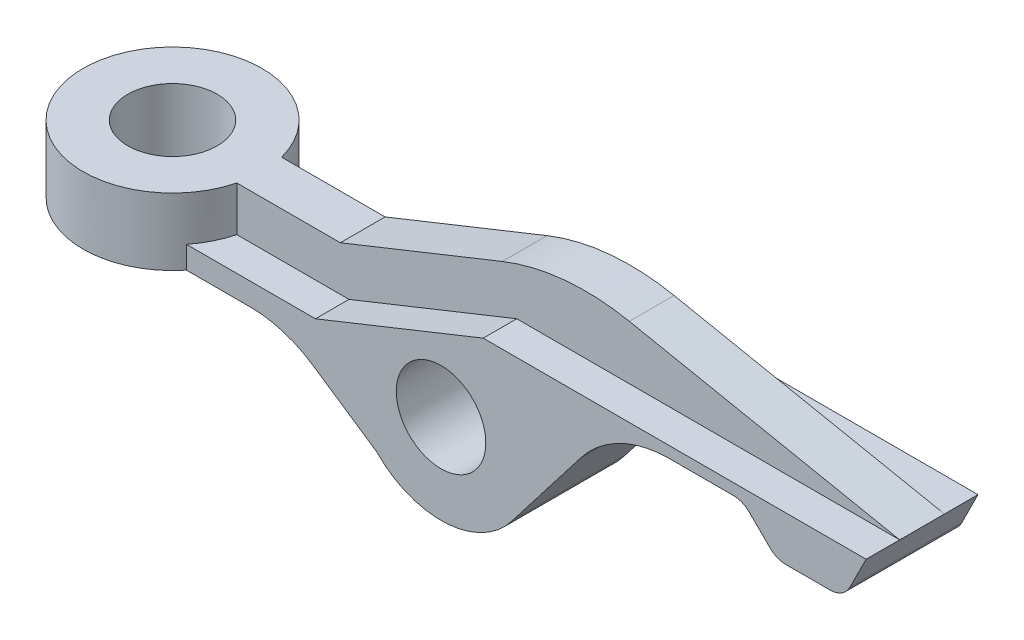
ISO-10303-21;
HEADER;
FILE_DESCRIPTION(('STEP AP214'),'2;1');
FILE_NAME('part.step','',(''),(''),'','','');
FILE_SCHEMA(('AUTOMOTIVE_DESIGN { 1 0 10303 214 1 1 1 1 }'));
ENDSEC;
DATA;
#1=APPLICATION_CONTEXT('core data for automotive mechanical design processes');
#2=APPLICATION_PROTOCOL_DEFINITION('international standard','automotive_design',2000,#1);
#3=PRODUCT_CONTEXT('',#1,'mechanical');
#4=PRODUCT('Part','Part','',(#3));
#5=PRODUCT_RELATED_PRODUCT_CATEGORY('part','',(#4));
#6=PRODUCT_DEFINITION_FORMATION('','',#4);
#7=PRODUCT_DEFINITION_CONTEXT('part definition',#1,'design');
#8=PRODUCT_DEFINITION('design','',#6,#7);
#9=PRODUCT_DEFINITION_SHAPE('','',#8);
#10=(LENGTH_UNIT() NAMED_UNIT(*) SI_UNIT(.MILLI.,.METRE.));
#11=(NAMED_UNIT(*) PLANE_ANGLE_UNIT() SI_UNIT($,.RADIAN.));
#12=(NAMED_UNIT(*) SI_UNIT($,.STERADIAN.) SOLID_ANGLE_UNIT());
#13=UNCERTAINTY_MEASURE_WITH_UNIT(LENGTH_MEASURE(1.E-05),#10,'distance_accuracy_value','');
#14=(GEOMETRIC_REPRESENTATION_CONTEXT(3) GLOBAL_UNCERTAINTY_ASSIGNED_CONTEXT((#13)) GLOBAL_UNIT_ASSIGNED_CONTEXT((#10,
#11,#12)) REPRESENTATION_CONTEXT('',''));
#15=CARTESIAN_POINT('',(0.,0.,0.));
#16=DIRECTION('',(0.,0.,1.));
#17=DIRECTION('',(1.,0.,0.));
#18=AXIS2_PLACEMENT_3D('',#15,#16,#17);
#19=CARTESIAN_POINT('',(19.0000000000001,3.99999999999991,0.999999999999999));
#20=DIRECTION('',(-0.196116135138185,-0.980580675690923,0.));
#21=DIRECTION('',(0.980580675690923,-0.196116135138184,0.));
#22=AXIS2_PLACEMENT_3D('',#19,#20,#21);
#23=PLANE('',#22);
#24=DIRECTION('',(-0.980580675690923,0.196116135138185,0.));
#25=VECTOR('',#24,1.);
#26=CARTESIAN_POINT('',(19.0000000000001,3.99999999999991,-0.999999999999999));
#27=LINE('',#26,#25);
#28=CARTESIAN_POINT('',(19.0000000000001,3.99999999999991,-0.999999999999999));
#29=VERTEX_POINT('',#28);
#30=CARTESIAN_POINT('',(6.91497899652095,6.41700420069601,-0.999999999999999));
#31=VERTEX_POINT('',#30);
#32=EDGE_CURVE('E287',#29,#31,#27,.T.);
#33=ORIENTED_EDGE('',*,*,#32,.T.);
#34=DIRECTION('',(0.,0.,-1.));
#35=VECTOR('',#34,1.);
#36=CARTESIAN_POINT('',(6.91497899652095,6.41700420069601,0.999999999999999));
#37=LINE('',#36,#35);
#38=CARTESIAN_POINT('',(6.91497899652095,6.41700420069601,0.999999999999999));
#39=VERTEX_POINT('',#38);
#40=EDGE_CURVE('E318',#39,#31,#37,.T.);
#41=ORIENTED_EDGE('',*,*,#40,.F.);
#42=DIRECTION('',(-0.980580675690923,0.196116135138185,0.));
#43=VECTOR('',#42,1.);
#44=CARTESIAN_POINT('',(19.0000000000001,3.99999999999991,0.999999999999999));
#45=LINE('',#44,#43);
#46=CARTESIAN_POINT('',(19.0000000000001,3.99999999999991,0.999999999999999));
#47=VERTEX_POINT('',#46);
#48=EDGE_CURVE('E302',#47,#39,#45,.T.);
#49=ORIENTED_EDGE('',*,*,#48,.F.);
#50=DIRECTION('',(0.,0.,-1.));
#51=VECTOR('',#50,1.);
#52=CARTESIAN_POINT('',(19.0000000000001,3.99999999999991,0.999999999999999));
#53=LINE('',#52,#51);
#54=EDGE_CURVE('E41',#47,#29,#53,.T.);
#55=ORIENTED_EDGE('',*,*,#54,.T.);
#56=EDGE_LOOP('',(#33,#41,#49,#55));
#57=FACE_BOUND('',#56,.T.);
#58=ADVANCED_FACE('F34',(#57),#23,.F.);
#59=CARTESIAN_POINT('',(4.95381764513907,-3.38880255621338,0.999999999999999));
#60=DIRECTION('',(0.,0.,-1.));
#61=DIRECTION('',(-1.,0.,0.));
#62=AXIS2_PLACEMENT_3D('',#59,#60,#61);
#63=CYLINDRICAL_SURFACE('',#62,10.);
#64=CARTESIAN_POINT('',(4.95381764513907,-3.38880255621338,-0.999999999999999));
#65=DIRECTION('',(0.,0.,1.));
#66=DIRECTION('',(1.,0.,0.));
#67=AXIS2_PLACEMENT_3D('',#64,#65,#66);
#68=CIRCLE('',#67,10.);
#69=CARTESIAN_POINT('',(1.23991088159803,5.89596435263932,-0.999999999999999));
#70=VERTEX_POINT('',#69);
#71=EDGE_CURVE('E289',#31,#70,#68,.T.);
#72=ORIENTED_EDGE('',*,*,#71,.T.);
#73=DIRECTION('',(0.,0.,-1.));
#74=VECTOR('',#73,1.);
#75=CARTESIAN_POINT('',(1.23991088159803,5.89596435263932,0.999999999999999));
#76=LINE('',#75,#74);
#77=CARTESIAN_POINT('',(1.23991088159803,5.89596435263932,0.999999999999999));
#78=VERTEX_POINT('',#77);
#79=EDGE_CURVE('E315',#78,#70,#76,.T.);
#80=ORIENTED_EDGE('',*,*,#79,.F.);
#81=CARTESIAN_POINT('',(4.95381764513907,-3.38880255621338,0.999999999999999));
#82=DIRECTION('',(0.,0.,1.));
#83=DIRECTION('',(1.,0.,0.));
#84=AXIS2_PLACEMENT_3D('',#81,#82,#83);
#85=CIRCLE('',#84,10.);
#86=EDGE_CURVE('E304',#39,#78,#85,.T.);
#87=ORIENTED_EDGE('',*,*,#86,.F.);
#88=ORIENTED_EDGE('',*,*,#40,.T.);
#89=EDGE_LOOP('',(#72,#80,#87,#88));
#90=FACE_BOUND('',#89,.T.);
#91=ADVANCED_FACE('F472',(#90),#63,.T.);
#92=CARTESIAN_POINT('',(1.23991088159803,5.89596435263932,0.999999999999999));
#93=DIRECTION('',(0.371390676354105,-0.928476690885262,0.));
#94=DIRECTION('',(0.928476690885262,0.371390676354105,0.));
#95=AXIS2_PLACEMENT_3D('',#92,#93,#94);
#96=PLANE('',#95);
#97=DIRECTION('',(-0.928476690885262,-0.371390676354105,0.));
#98=VECTOR('',#97,1.);
#99=CARTESIAN_POINT('',(1.23991088159803,5.89596435263932,-0.999999999999999));
#100=LINE('',#99,#98);
#101=CARTESIAN_POINT('',(-6.00000000000005,2.99999999999991,-0.999999999999999));
#102=VERTEX_POINT('',#101);
#103=EDGE_CURVE('E291',#70,#102,#100,.T.);
#104=ORIENTED_EDGE('',*,*,#103,.T.);
#105=DIRECTION('',(0.,0.,-1.));
#106=VECTOR('',#105,1.);
#107=CARTESIAN_POINT('',(-6.00000000000005,2.99999999999991,0.999999999999999));
#108=LINE('',#107,#106);
#109=CARTESIAN_POINT('',(-6.00000000000005,2.99999999999991,0.999999999999999));
#110=VERTEX_POINT('',#109);
#111=EDGE_CURVE('E312',#110,#102,#108,.T.);
#112=ORIENTED_EDGE('',*,*,#111,.F.);
#113=DIRECTION('',(-0.928476690885262,-0.371390676354105,0.));
#114=VECTOR('',#113,1.);
#115=CARTESIAN_POINT('',(1.23991088159803,5.89596435263932,0.999999999999999));
#116=LINE('',#115,#114);
#117=EDGE_CURVE('E306',#78,#110,#116,.T.);
#118=ORIENTED_EDGE('',*,*,#117,.F.);
#119=ORIENTED_EDGE('',*,*,#79,.T.);
#120=EDGE_LOOP('',(#104,#112,#118,#119));
#121=FACE_BOUND('',#120,.T.);
#122=ADVANCED_FACE('F476',(#121),#96,.F.);
#123=CARTESIAN_POINT('',(-6.00000000000005,2.99999999999991,0.999999999999999));
#124=DIRECTION('',(0.,-1.,0.));
#125=DIRECTION('',(1.,0.,0.));
#126=AXIS2_PLACEMENT_3D('',#123,#124,#125);
#127=PLANE('',#126);
#128=DIRECTION('',(-1.,0.,0.));
#129=VECTOR('',#128,1.);
#130=CARTESIAN_POINT('',(-6.00000000000005,2.99999999999991,-0.999999999999999));
#131=LINE('',#130,#129);
#132=CARTESIAN_POINT('',(-10.6270166537927,2.99999999999998,-0.999999999999999));
#133=VERTEX_POINT('',#132);
#134=EDGE_CURVE('E293',#102,#133,#131,.T.);
#135=ORIENTED_EDGE('',*,*,#134,.T.);
#136=CARTESIAN_POINT('',(-14.5,3.00000000000007,0.));
#137=DIRECTION('',(0.,-1.,0.));
#138=DIRECTION('',(0.,0.,-1.));
#139=AXIS2_PLACEMENT_3D('',#136,#137,#138);
#140=CIRCLE('',#139,4.);
#141=CARTESIAN_POINT('',(-10.6270166537927,2.99999999999998,0.999999999999999));
#142=VERTEX_POINT('',#141);
#143=EDGE_CURVE('E204',#142,#133,#140,.T.);
#144=ORIENTED_EDGE('',*,*,#143,.F.);
#145=DIRECTION('',(-1.,0.,0.));
#146=VECTOR('',#145,1.);
#147=CARTESIAN_POINT('',(-6.00000000000005,2.99999999999991,0.999999999999999));
#148=LINE('',#147,#146);
#149=EDGE_CURVE('E308',#110,#142,#148,.T.);
#150=ORIENTED_EDGE('',*,*,#149,.F.);
#151=ORIENTED_EDGE('',*,*,#111,.T.);
#152=EDGE_LOOP('',(#135,#144,#150,#151));
#153=FACE_BOUND('',#152,.T.);
#154=CARTESIAN_POINT('',(-14.5,3.00000000000007,0.));
#155=DIRECTION('',(0.,-1.,0.));
#156=DIRECTION('',(0.,0.,-1.));
#157=AXIS2_PLACEMENT_3D('',#154,#155,#156);
#158=CIRCLE('',#157,2.);
#159=CARTESIAN_POINT('',(-14.5,3.00000000000007,-2.));
#160=VERTEX_POINT('',#159);
#161=EDGE_CURVE('E205',#160,#160,#158,.T.);
#162=ORIENTED_EDGE('',*,*,#161,.T.);
#163=EDGE_LOOP('',(#162));
#164=FACE_BOUND('',#163,.T.);
#165=ADVANCED_FACE('F480',(#153,#164),#127,.F.);
#166=CARTESIAN_POINT('',(4.95381764513907,-3.38880255621338,0.999999999999999));
#167=DIRECTION('',(0.,0.,1.));
#168=DIRECTION('',(1.,0.,0.));
#169=AXIS2_PLACEMENT_3D('',#166,#167,#168);
#170=PLANE('',#169);
#171=DIRECTION('',(0.,-1.,0.));
#172=VECTOR('',#171,1.);
#173=CARTESIAN_POINT('',(-10.6270166537927,2.99999999999998,0.999999999999999));
#174=LINE('',#173,#172);
#175=CARTESIAN_POINT('',(-10.6270166537926,0.999999999999987,0.999999999999999));
#176=VERTEX_POINT('',#175);
#177=EDGE_CURVE('E398',#176,#142,#174,.F.);
#178=ORIENTED_EDGE('',*,*,#177,.F.);
#179=DIRECTION('',(1.,0.,0.));
#180=VECTOR('',#179,1.);
#181=CARTESIAN_POINT('',(-5.61483519286551,0.999999999999918,0.999999999999999));
#182=LINE('',#181,#180);
#183=CARTESIAN_POINT('',(-5.61483519286551,0.999999999999918,0.999999999999999));
#184=VERTEX_POINT('',#183);
#185=EDGE_CURVE('E56',#176,#184,#182,.T.);
#186=ORIENTED_EDGE('',*,*,#185,.T.);
#187=DIRECTION('',(0.928476690885262,0.371390676354105,0.));
#188=VECTOR('',#187,1.);
#189=CARTESIAN_POINT('',(1.88516480713305,3.99999999999941,0.999999999999999));
#190=LINE('',#189,#188);
#191=CARTESIAN_POINT('',(1.88516480713305,3.99999999999941,0.999999999999999));
#192=VERTEX_POINT('',#191);
#193=EDGE_CURVE('E298',#184,#192,#190,.T.);
#194=ORIENTED_EDGE('',*,*,#193,.T.);
#195=DIRECTION('',(1.,0.,0.));
#196=VECTOR('',#195,1.);
#197=CARTESIAN_POINT('',(19.0000000000001,3.99999999999991,0.999999999999999));
#198=LINE('',#197,#196);
#199=EDGE_CURVE('E300',#192,#47,#198,.T.);
#200=ORIENTED_EDGE('',*,*,#199,.T.);
#201=ORIENTED_EDGE('',*,*,#48,.T.);
#202=ORIENTED_EDGE('',*,*,#86,.T.);
#203=ORIENTED_EDGE('',*,*,#117,.T.);
#204=ORIENTED_EDGE('',*,*,#149,.T.);
#205=EDGE_LOOP('',(#178,#186,#194,#200,#201,#202,#203,#204));
#206=FACE_BOUND('',#205,.T.);
#207=ADVANCED_FACE('F468',(#206),#170,.T.);
#208=CARTESIAN_POINT('',(4.95381764513907,-3.38880255621338,-0.999999999999999));
#209=DIRECTION('',(0.,0.,1.));
#210=DIRECTION('',(1.,0.,0.));
#211=AXIS2_PLACEMENT_3D('',#208,#209,#210);
#212=PLANE('',#211);
#213=DIRECTION('',(1.,0.,0.));
#214=VECTOR('',#213,1.);
#215=CARTESIAN_POINT('',(-5.61483519286551,0.999999999999918,-0.999999999999999));
#216=LINE('',#215,#214);
#217=CARTESIAN_POINT('',(-10.6270166537926,0.999999999999987,-0.999999999999999));
#218=VERTEX_POINT('',#217);
#219=CARTESIAN_POINT('',(-5.61483519286551,0.999999999999918,-0.999999999999999));
#220=VERTEX_POINT('',#219);
#221=EDGE_CURVE('E296',#218,#220,#216,.T.);
#222=ORIENTED_EDGE('',*,*,#221,.F.);
#223=DIRECTION('',(0.,-1.,0.));
#224=VECTOR('',#223,1.);
#225=CARTESIAN_POINT('',(-10.6270166537927,2.99999999999998,-0.999999999999999));
#226=LINE('',#225,#224);
#227=EDGE_CURVE('E215',#218,#133,#226,.F.);
#228=ORIENTED_EDGE('',*,*,#227,.T.);
#229=ORIENTED_EDGE('',*,*,#134,.F.);
#230=ORIENTED_EDGE('',*,*,#103,.F.);
#231=ORIENTED_EDGE('',*,*,#71,.F.);
#232=ORIENTED_EDGE('',*,*,#32,.F.);
#233=DIRECTION('',(1.,0.,0.));
#234=VECTOR('',#233,1.);
#235=CARTESIAN_POINT('',(19.0000000000001,3.99999999999991,-0.999999999999999));
#236=LINE('',#235,#234);
#237=CARTESIAN_POINT('',(1.88516480713305,3.99999999999941,-0.999999999999999));
#238=VERTEX_POINT('',#237);
#239=EDGE_CURVE('E284',#238,#29,#236,.T.);
#240=ORIENTED_EDGE('',*,*,#239,.F.);
#241=DIRECTION('',(0.928476690885262,0.371390676354105,0.));
#242=VECTOR('',#241,1.);
#243=CARTESIAN_POINT('',(1.88516480713305,3.99999999999941,-0.999999999999999));
#244=LINE('',#243,#242);
#245=EDGE_CURVE('E281',#220,#238,#244,.T.);
#246=ORIENTED_EDGE('',*,*,#245,.F.);
#247=EDGE_LOOP('',(#222,#228,#229,#230,#231,#232,#240,#246));
#248=FACE_BOUND('',#247,.T.);
#249=ADVANCED_FACE('F331',(#248),#212,.F.);
#250=CARTESIAN_POINT('',(19.0000000000001,3.99999999999991,2.5));
#251=DIRECTION('',(0.,-1.,0.));
#252=DIRECTION('',(1.,0.,0.));
#253=AXIS2_PLACEMENT_3D('',#250,#251,#252);
#254=PLANE('',#253);
#255=DIRECTION('',(0.,0.,-1.));
#256=VECTOR('',#255,1.);
#257=CARTESIAN_POINT('',(1.88516480713305,3.99999999999941,2.5));
#258=LINE('',#257,#256);
#259=CARTESIAN_POINT('',(1.88516480713305,3.99999999999941,-2.5));
#260=VERTEX_POINT('',#259);
#261=EDGE_CURVE('E252',#238,#260,#258,.T.);
#262=ORIENTED_EDGE('',*,*,#261,.F.);
#263=ORIENTED_EDGE('',*,*,#239,.T.);
#264=DIRECTION('',(0.,0.,-1.));
#265=VECTOR('',#264,1.);
#266=CARTESIAN_POINT('',(19.0000000000001,3.99999999999991,2.5));
#267=LINE('',#266,#265);
#268=CARTESIAN_POINT('',(19.0000000000001,3.99999999999991,-2.5));
#269=VERTEX_POINT('',#268);
#270=EDGE_CURVE('E256',#29,#269,#267,.T.);
#271=ORIENTED_EDGE('',*,*,#270,.T.);
#272=DIRECTION('',(-1.,0.,0.));
#273=VECTOR('',#272,1.);
#274=CARTESIAN_POINT('',(19.0000000000001,3.99999999999991,-2.5));
#275=LINE('',#274,#273);
#276=EDGE_CURVE('E347',#269,#260,#275,.T.);
#277=ORIENTED_EDGE('',*,*,#276,.T.);
#278=EDGE_LOOP('',(#262,#263,#271,#277));
#279=FACE_BOUND('',#278,.T.);
#280=ADVANCED_FACE('F336',(#279),#254,.F.);
#281=CARTESIAN_POINT('',(1.88516480713305,3.99999999999941,2.5));
#282=DIRECTION('',(0.371390676354105,-0.928476690885262,0.));
#283=DIRECTION('',(0.928476690885262,0.371390676354105,0.));
#284=AXIS2_PLACEMENT_3D('',#281,#282,#283);
#285=PLANE('',#284);
#286=DIRECTION('',(0.,0.,-1.));
#287=VECTOR('',#286,1.);
#288=CARTESIAN_POINT('',(-5.61483519286551,0.999999999999918,2.5));
#289=LINE('',#288,#287);
#290=CARTESIAN_POINT('',(-5.61483519286551,0.999999999999918,-2.5));
#291=VERTEX_POINT('',#290);
#292=EDGE_CURVE('E248',#220,#291,#289,.T.);
#293=ORIENTED_EDGE('',*,*,#292,.F.);
#294=ORIENTED_EDGE('',*,*,#245,.T.);
#295=ORIENTED_EDGE('',*,*,#261,.T.);
#296=DIRECTION('',(-0.928476690885262,-0.371390676354105,0.));
#297=VECTOR('',#296,1.);
#298=CARTESIAN_POINT('',(1.88516480713305,3.99999999999941,-2.5));
#299=LINE('',#298,#297);
#300=EDGE_CURVE('E354',#260,#291,#299,.T.);
#301=ORIENTED_EDGE('',*,*,#300,.T.);
#302=EDGE_LOOP('',(#293,#294,#295,#301));
#303=FACE_BOUND('',#302,.T.);
#304=ADVANCED_FACE('F493',(#303),#285,.F.);
#305=CARTESIAN_POINT('',(-5.61483519286551,0.999999999999918,2.5));
#306=DIRECTION('',(0.,-1.,0.));
#307=DIRECTION('',(1.,0.,0.));
#308=AXIS2_PLACEMENT_3D('',#305,#306,#307);
#309=PLANE('',#308);
#310=DIRECTION('',(-1.,0.,0.));
#311=VECTOR('',#310,1.);
#312=CARTESIAN_POINT('',(-5.61483519286551,0.999999999999918,-2.5));
#313=LINE('',#312,#311);
#314=CARTESIAN_POINT('',(-11.3775010008008,1.,-2.5));
#315=VERTEX_POINT('',#314);
#316=EDGE_CURVE('E356',#291,#315,#313,.T.);
#317=ORIENTED_EDGE('',*,*,#316,.T.);
#318=CARTESIAN_POINT('',(-14.5000000000001,0.999999999999987,0.));
#319=DIRECTION('',(0.,-1.,0.));
#320=DIRECTION('',(1.,0.,0.));
#321=AXIS2_PLACEMENT_3D('',#318,#319,#320);
#322=CIRCLE('',#321,4.);
#323=EDGE_CURVE('E484',#315,#218,#322,.T.);
#324=ORIENTED_EDGE('',*,*,#323,.T.);
#325=ORIENTED_EDGE('',*,*,#221,.T.);
#326=ORIENTED_EDGE('',*,*,#292,.T.);
#327=EDGE_LOOP('',(#317,#324,#325,#326));
#328=FACE_BOUND('',#327,.T.);
#329=ADVANCED_FACE('F490',(#328),#309,.F.);
#330=CARTESIAN_POINT('',(10.2092774224831,-1.49999999999999,2.5));
#331=DIRECTION('',(0.,0.,-1.));
#332=DIRECTION('',(-1.,0.,0.));
#333=AXIS2_PLACEMENT_3D('',#330,#331,#332);
#334=CYLINDRICAL_SURFACE('',#333,5.);
#335=CARTESIAN_POINT('',(10.2092774224831,-1.49999999999999,-2.5));
#336=DIRECTION('',(0.,0.,-1.));
#337=DIRECTION('',(1.,0.,0.));
#338=AXIS2_PLACEMENT_3D('',#335,#336,#337);
#339=CIRCLE('',#338,5.);
#340=CARTESIAN_POINT('',(6.25121616511112,1.55511883285926,-2.5));
#341=VERTEX_POINT('',#340);
#342=CARTESIAN_POINT('',(10.2092774224832,3.50000000000002,-2.5));
#343=VERTEX_POINT('',#342);
#344=EDGE_CURVE('E400',#341,#343,#339,.T.);
#345=ORIENTED_EDGE('',*,*,#344,.T.);
#346=DIRECTION('',(0.,0.,-1.));
#347=VECTOR('',#346,1.);
#348=CARTESIAN_POINT('',(10.2092774224832,3.50000000000002,2.5));
#349=LINE('',#348,#347);
#350=CARTESIAN_POINT('',(10.2092774224832,3.50000000000002,2.5));
#351=VERTEX_POINT('',#350);
#352=EDGE_CURVE('E278',#351,#343,#349,.T.);
#353=ORIENTED_EDGE('',*,*,#352,.F.);
#354=CARTESIAN_POINT('',(10.2092774224831,-1.49999999999999,2.5));
#355=DIRECTION('',(0.,0.,-1.));
#356=DIRECTION('',(1.,0.,0.));
#357=AXIS2_PLACEMENT_3D('',#354,#355,#356);
#358=CIRCLE('',#357,5.);
#359=CARTESIAN_POINT('',(6.25121616511112,1.55511883285926,2.5));
#360=VERTEX_POINT('',#359);
#361=EDGE_CURVE('E372',#360,#351,#358,.T.);
#362=ORIENTED_EDGE('',*,*,#361,.F.);
#363=DIRECTION('',(0.,0.,-1.));
#364=VECTOR('',#363,1.);
#365=CARTESIAN_POINT('',(6.25121616511112,1.55511883285926,2.5));
#366=LINE('',#365,#364);
#367=EDGE_CURVE('E235',#360,#341,#366,.T.);
#368=ORIENTED_EDGE('',*,*,#367,.T.);
#369=EDGE_LOOP('',(#345,#353,#362,#368));
#370=FACE_BOUND('',#369,.T.);
#371=ADVANCED_FACE('F445',(#370),#334,.F.);
#372=CARTESIAN_POINT('',(10.2092774224832,3.50000000000002,2.5));
#373=DIRECTION('',(0.,1.,0.));
#374=DIRECTION('',(0.,0.,1.));
#375=AXIS2_PLACEMENT_3D('',#372,#373,#374);
#376=PLANE('',#375);
#377=DIRECTION('',(1.,0.,0.));
#378=VECTOR('',#377,1.);
#379=CARTESIAN_POINT('',(10.2092774224832,3.50000000000002,-2.5));
#380=LINE('',#379,#378);
#381=CARTESIAN_POINT('',(13.0705171852828,3.50000000000002,-2.5));
#382=VERTEX_POINT('',#381);
#383=EDGE_CURVE('E406',#343,#382,#380,.T.);
#384=ORIENTED_EDGE('',*,*,#383,.T.);
#385=DIRECTION('',(0.,0.,-1.));
#386=VECTOR('',#385,1.);
#387=CARTESIAN_POINT('',(13.0705171852828,3.50000000000002,2.5));
#388=LINE('',#387,#386);
#389=CARTESIAN_POINT('',(13.0705171852828,3.50000000000002,2.5));
#390=VERTEX_POINT('',#389);
#391=EDGE_CURVE('E275',#390,#382,#388,.T.);
#392=ORIENTED_EDGE('',*,*,#391,.F.);
#393=DIRECTION('',(1.,0.,0.));
#394=VECTOR('',#393,1.);
#395=CARTESIAN_POINT('',(10.2092774224832,3.50000000000002,2.5));
#396=LINE('',#395,#394);
#397=EDGE_CURVE('E375',#351,#390,#396,.T.);
#398=ORIENTED_EDGE('',*,*,#397,.F.);
#399=ORIENTED_EDGE('',*,*,#352,.T.);
#400=EDGE_LOOP('',(#384,#392,#398,#399));
#401=FACE_BOUND('',#400,.T.);
#402=ADVANCED_FACE('F441',(#401),#376,.F.);
#403=CARTESIAN_POINT('',(13.0705171852828,2.50000000000011,2.5));
#404=DIRECTION('',(0.,0.,-1.));
#405=DIRECTION('',(-1.,0.,0.));
#406=AXIS2_PLACEMENT_3D('',#403,#404,#405);
#407=CYLINDRICAL_SURFACE('',#406,1.);
#408=CARTESIAN_POINT('',(13.0705171852828,2.50000000000011,-2.5));
#409=DIRECTION('',(0.,0.,-1.));
#410=DIRECTION('',(1.,0.,0.));
#411=AXIS2_PLACEMENT_3D('',#408,#409,#410);
#412=CIRCLE('',#411,1.);
#413=CARTESIAN_POINT('',(13.7731740867481,3.21152883203943,-2.5));
#414=VERTEX_POINT('',#413);
#415=EDGE_CURVE('E408',#382,#414,#412,.T.);
#416=ORIENTED_EDGE('',*,*,#415,.T.);
#417=DIRECTION('',(0.,0.,-1.));
#418=VECTOR('',#417,1.);
#419=CARTESIAN_POINT('',(13.7731740867481,3.21152883203943,2.5));
#420=LINE('',#419,#418);
#421=CARTESIAN_POINT('',(13.7731740867481,3.21152883203943,2.5));
#422=VERTEX_POINT('',#421);
#423=EDGE_CURVE('E272',#422,#414,#420,.T.);
#424=ORIENTED_EDGE('',*,*,#423,.F.);
#425=CARTESIAN_POINT('',(13.0705171852828,2.50000000000011,2.5));
#426=DIRECTION('',(0.,0.,-1.));
#427=DIRECTION('',(1.,0.,0.));
#428=AXIS2_PLACEMENT_3D('',#425,#426,#427);
#429=CIRCLE('',#428,1.);
#430=EDGE_CURVE('E377',#390,#422,#429,.T.);
#431=ORIENTED_EDGE('',*,*,#430,.F.);
#432=ORIENTED_EDGE('',*,*,#391,.T.);
#433=EDGE_LOOP('',(#416,#424,#431,#432));
#434=FACE_BOUND('',#433,.T.);
#435=ADVANCED_FACE('F437',(#434),#407,.F.);
#436=CARTESIAN_POINT('',(13.7731740867481,3.21152883203943,2.5));
#437=DIRECTION('',(0.702656901465264,0.71152883203932,0.));
#438=DIRECTION('',(-0.71152883203932,0.702656901465264,0.));
#439=AXIS2_PLACEMENT_3D('',#436,#437,#438);
#440=PLANE('',#439);
#441=DIRECTION('',(0.71152883203932,-0.702656901465264,0.));
#442=VECTOR('',#441,1.);
#443=CARTESIAN_POINT('',(13.7731740867481,3.21152883203943,-2.5));
#444=LINE('',#443,#442);
#445=CARTESIAN_POINT('',(14.7078865193126,2.28847116796072,-2.5));
#446=VERTEX_POINT('',#445);
#447=EDGE_CURVE('E410',#414,#446,#444,.T.);
#448=ORIENTED_EDGE('',*,*,#447,.T.);
#449=DIRECTION('',(0.,0.,-1.));
#450=VECTOR('',#449,1.);
#451=CARTESIAN_POINT('',(14.7078865193126,2.28847116796072,2.5));
#452=LINE('',#451,#450);
#453=CARTESIAN_POINT('',(14.7078865193126,2.28847116796072,2.5));
#454=VERTEX_POINT('',#453);
#455=EDGE_CURVE('E269',#454,#446,#452,.T.);
#456=ORIENTED_EDGE('',*,*,#455,.F.);
#457=DIRECTION('',(0.71152883203932,-0.702656901465264,0.));
#458=VECTOR('',#457,1.);
#459=CARTESIAN_POINT('',(13.7731740867481,3.21152883203943,2.5));
#460=LINE('',#459,#458);
#461=EDGE_CURVE('E379',#422,#454,#460,.T.);
#462=ORIENTED_EDGE('',*,*,#461,.F.);
#463=ORIENTED_EDGE('',*,*,#423,.T.);
#464=EDGE_LOOP('',(#448,#456,#462,#463));
#465=FACE_BOUND('',#464,.T.);
#466=ADVANCED_FACE('F432',(#465),#440,.F.);
#467=CARTESIAN_POINT('',(15.4105434207778,3.00000000000002,2.5));
#468=DIRECTION('',(0.,0.,-1.));
#469=DIRECTION('',(-1.,0.,0.));
#470=AXIS2_PLACEMENT_3D('',#467,#468,#469);
#471=CYLINDRICAL_SURFACE('',#470,1.);
#472=CARTESIAN_POINT('',(15.4105434207778,3.00000000000002,-2.5));
#473=DIRECTION('',(0.,0.,1.));
#474=DIRECTION('',(-1.,0.,0.));
#475=AXIS2_PLACEMENT_3D('',#472,#473,#474);
#476=CIRCLE('',#475,1.);
#477=CARTESIAN_POINT('',(15.4105434207778,2.00000000000002,-2.5));
#478=VERTEX_POINT('',#477);
#479=EDGE_CURVE('E412',#446,#478,#476,.T.);
#480=ORIENTED_EDGE('',*,*,#479,.T.);
#481=DIRECTION('',(0.,0.,-1.));
#482=VECTOR('',#481,1.);
#483=CARTESIAN_POINT('',(15.4105434207778,2.00000000000002,2.5));
#484=LINE('',#483,#482);
#485=CARTESIAN_POINT('',(15.4105434207778,2.00000000000002,2.5));
#486=VERTEX_POINT('',#485);
#487=EDGE_CURVE('E266',#486,#478,#484,.T.);
#488=ORIENTED_EDGE('',*,*,#487,.F.);
#489=CARTESIAN_POINT('',(15.4105434207778,3.00000000000002,2.5));
#490=DIRECTION('',(0.,0.,1.));
#491=DIRECTION('',(-1.,0.,0.));
#492=AXIS2_PLACEMENT_3D('',#489,#490,#491);
#493=CIRCLE('',#492,1.);
#494=EDGE_CURVE('E381',#454,#486,#493,.T.);
#495=ORIENTED_EDGE('',*,*,#494,.F.);
#496=ORIENTED_EDGE('',*,*,#455,.T.);
#497=EDGE_LOOP('',(#480,#488,#495,#496));
#498=FACE_BOUND('',#497,.T.);
#499=ADVANCED_FACE('F428',(#498),#471,.T.);
#500=CARTESIAN_POINT('',(15.4105434207778,2.00000000000002,2.5));
#501=DIRECTION('',(0.,1.,0.));
#502=DIRECTION('',(0.,0.,1.));
#503=AXIS2_PLACEMENT_3D('',#500,#501,#502);
#504=PLANE('',#503);
#505=DIRECTION('',(1.,0.,0.));
#506=VECTOR('',#505,1.);
#507=CARTESIAN_POINT('',(15.4105434207778,2.00000000000002,-2.5));
#508=LINE('',#507,#506);
#509=CARTESIAN_POINT('',(17.3819660112502,1.99999999999993,-2.5));
#510=VERTEX_POINT('',#509);
#511=EDGE_CURVE('E414',#478,#510,#508,.T.);
#512=ORIENTED_EDGE('',*,*,#511,.T.);
#513=DIRECTION('',(0.,0.,-1.));
#514=VECTOR('',#513,1.);
#515=CARTESIAN_POINT('',(17.3819660112502,1.99999999999993,2.5));
#516=LINE('',#515,#514);
#517=CARTESIAN_POINT('',(17.3819660112502,1.99999999999993,2.5));
#518=VERTEX_POINT('',#517);
#519=EDGE_CURVE('E263',#518,#510,#516,.T.);
#520=ORIENTED_EDGE('',*,*,#519,.F.);
#521=DIRECTION('',(1.,0.,0.));
#522=VECTOR('',#521,1.);
#523=CARTESIAN_POINT('',(15.4105434207778,2.00000000000002,2.5));
#524=LINE('',#523,#522);
#525=EDGE_CURVE('E383',#486,#518,#524,.T.);
#526=ORIENTED_EDGE('',*,*,#525,.F.);
#527=ORIENTED_EDGE('',*,*,#487,.T.);
#528=EDGE_LOOP('',(#512,#520,#526,#527));
#529=FACE_BOUND('',#528,.T.);
#530=ADVANCED_FACE('F423',(#529),#504,.F.);
#531=CARTESIAN_POINT('',(17.3819660112501,3.,2.5));
#532=DIRECTION('',(0.,0.,-1.));
#533=DIRECTION('',(-1.,0.,0.));
#534=AXIS2_PLACEMENT_3D('',#531,#532,#533);
#535=CYLINDRICAL_SURFACE('',#534,0.999999999999999);
#536=CARTESIAN_POINT('',(17.3819660112501,3.,-2.5));
#537=DIRECTION('',(0.,0.,1.));
#538=DIRECTION('',(-1.,0.,0.));
#539=AXIS2_PLACEMENT_3D('',#536,#537,#538);
#540=CIRCLE('',#539,0.999999999999999);
#541=CARTESIAN_POINT('',(18.2763932022501,2.55278640450005,-2.5));
#542=VERTEX_POINT('',#541);
#543=EDGE_CURVE('E348',#510,#542,#540,.T.);
#544=ORIENTED_EDGE('',*,*,#543,.T.);
#545=DIRECTION('',(0.,0.,-1.));
#546=VECTOR('',#545,1.);
#547=CARTESIAN_POINT('',(18.2763932022501,2.55278640450005,2.5));
#548=LINE('',#547,#546);
#549=CARTESIAN_POINT('',(18.2763932022501,2.55278640450005,2.5));
#550=VERTEX_POINT('',#549);
#551=EDGE_CURVE('E260',#550,#542,#548,.T.);
#552=ORIENTED_EDGE('',*,*,#551,.F.);
#553=CARTESIAN_POINT('',(17.3819660112501,3.,2.5));
#554=DIRECTION('',(0.,0.,1.));
#555=DIRECTION('',(-1.,0.,0.));
#556=AXIS2_PLACEMENT_3D('',#553,#554,#555);
#557=CIRCLE('',#556,0.999999999999999);
#558=EDGE_CURVE('E385',#518,#550,#557,.T.);
#559=ORIENTED_EDGE('',*,*,#558,.F.);
#560=ORIENTED_EDGE('',*,*,#519,.T.);
#561=EDGE_LOOP('',(#544,#552,#559,#560));
#562=FACE_BOUND('',#561,.T.);
#563=ADVANCED_FACE('F416',(#562),#535,.T.);
#564=CARTESIAN_POINT('',(18.2763932022501,2.55278640450005,2.5));
#565=DIRECTION('',(-0.894427190999918,0.447213595499959,0.));
#566=DIRECTION('',(-0.447213595499959,-0.894427190999919,0.));
#567=AXIS2_PLACEMENT_3D('',#564,#565,#566);
#568=PLANE('',#567);
#569=DIRECTION('',(0.447213595499959,0.894427190999918,0.));
#570=VECTOR('',#569,1.);
#571=CARTESIAN_POINT('',(18.2763932022501,2.55278640450005,-2.5));
#572=LINE('',#571,#570);
#573=EDGE_CURVE('E341',#542,#269,#572,.T.);
#574=ORIENTED_EDGE('',*,*,#573,.T.);
#575=ORIENTED_EDGE('',*,*,#270,.F.);
#576=ORIENTED_EDGE('',*,*,#54,.F.);
#577=CARTESIAN_POINT('',(19.0000000000001,3.99999999999991,2.5));
#578=VERTEX_POINT('',#577);
#579=EDGE_CURVE('E257',#578,#47,#267,.T.);
#580=ORIENTED_EDGE('',*,*,#579,.F.);
#581=DIRECTION('',(0.447213595499959,0.894427190999918,0.));
#582=VECTOR('',#581,1.);
#583=CARTESIAN_POINT('',(18.2763932022501,2.55278640450005,2.5));
#584=LINE('',#583,#582);
#585=EDGE_CURVE('E387',#550,#578,#584,.T.);
#586=ORIENTED_EDGE('',*,*,#585,.F.);
#587=ORIENTED_EDGE('',*,*,#551,.T.);
#588=EDGE_LOOP('',(#574,#575,#576,#580,#586,#587));
#589=FACE_BOUND('',#588,.T.);
#590=ADVANCED_FACE('F339',(#589),#568,.F.);
#591=ORIENTED_EDGE('',*,*,#199,.F.);
#592=CARTESIAN_POINT('',(1.88516480713305,3.99999999999941,2.5));
#593=VERTEX_POINT('',#592);
#594=EDGE_CURVE('E253',#593,#192,#258,.T.);
#595=ORIENTED_EDGE('',*,*,#594,.F.);
#596=DIRECTION('',(-1.,0.,0.));
#597=VECTOR('',#596,1.);
#598=CARTESIAN_POINT('',(19.0000000000001,3.99999999999991,2.5));
#599=LINE('',#598,#597);
#600=EDGE_CURVE('E389',#578,#593,#599,.T.);
#601=ORIENTED_EDGE('',*,*,#600,.F.);
#602=ORIENTED_EDGE('',*,*,#579,.T.);
#603=EDGE_LOOP('',(#591,#595,#601,#602));
#604=FACE_BOUND('',#603,.T.);
#605=ADVANCED_FACE('F467',(#604),#254,.F.);
#606=ORIENTED_EDGE('',*,*,#193,.F.);
#607=CARTESIAN_POINT('',(-5.61483519286551,0.999999999999918,2.5));
#608=VERTEX_POINT('',#607);
#609=EDGE_CURVE('E249',#608,#184,#289,.T.);
#610=ORIENTED_EDGE('',*,*,#609,.F.);
#611=DIRECTION('',(-0.928476690885262,-0.371390676354105,0.));
#612=VECTOR('',#611,1.);
#613=CARTESIAN_POINT('',(1.88516480713305,3.99999999999941,2.5));
#614=LINE('',#613,#612);
#615=EDGE_CURVE('E226',#593,#608,#614,.T.);
#616=ORIENTED_EDGE('',*,*,#615,.F.);
#617=ORIENTED_EDGE('',*,*,#594,.T.);
#618=EDGE_LOOP('',(#606,#610,#616,#617));
#619=FACE_BOUND('',#618,.T.);
#620=ADVANCED_FACE('F395',(#619),#285,.F.);
#621=ORIENTED_EDGE('',*,*,#185,.F.);
#622=CARTESIAN_POINT('',(-14.5000000000001,0.999999999999987,0.));
#623=DIRECTION('',(0.,-1.,0.));
#624=DIRECTION('',(1.,0.,0.));
#625=AXIS2_PLACEMENT_3D('',#622,#623,#624);
#626=CIRCLE('',#625,4.);
#627=CARTESIAN_POINT('',(-11.3775010008008,1.,2.5));
#628=VERTEX_POINT('',#627);
#629=EDGE_CURVE('E214',#176,#628,#626,.T.);
#630=ORIENTED_EDGE('',*,*,#629,.T.);
#631=DIRECTION('',(-1.,0.,0.));
#632=VECTOR('',#631,1.);
#633=CARTESIAN_POINT('',(-5.61483519286551,0.999999999999918,2.5));
#634=LINE('',#633,#632);
#635=EDGE_CURVE('E213',#608,#628,#634,.T.);
#636=ORIENTED_EDGE('',*,*,#635,.F.);
#637=ORIENTED_EDGE('',*,*,#609,.T.);
#638=EDGE_LOOP('',(#621,#630,#636,#637));
#639=FACE_BOUND('',#638,.T.);
#640=ADVANCED_FACE('F397',(#639),#309,.F.);
#641=CARTESIAN_POINT('',(-12.,0.,2.5));
#642=DIRECTION('',(0.,1.,0.));
#643=DIRECTION('',(0.,0.,1.));
#644=AXIS2_PLACEMENT_3D('',#641,#642,#643);
#645=PLANE('',#644);
#646=DIRECTION('',(1.,0.,0.));
#647=VECTOR('',#646,1.);
#648=CARTESIAN_POINT('',(-12.,0.,2.5));
#649=LINE('',#648,#647);
#650=CARTESIAN_POINT('',(-11.3775010008008,0.,2.5));
#651=VERTEX_POINT('',#650);
#652=CARTESIAN_POINT('',(-8.52733925980312,0.,2.5));
#653=VERTEX_POINT('',#652);
#654=EDGE_CURVE('E210',#651,#653,#649,.T.);
#655=ORIENTED_EDGE('',*,*,#654,.F.);
#656=CARTESIAN_POINT('',(-14.5,0.,0.));
#657=DIRECTION('',(0.,-1.,0.));
#658=DIRECTION('',(0.,0.,-1.));
#659=AXIS2_PLACEMENT_3D('',#656,#657,#658);
#660=CIRCLE('',#659,4.);
#661=CARTESIAN_POINT('',(-11.3775010008008,0.,-2.5));
#662=VERTEX_POINT('',#661);
#663=EDGE_CURVE('E48',#651,#662,#660,.T.);
#664=ORIENTED_EDGE('',*,*,#663,.T.);
#665=DIRECTION('',(1.,0.,0.));
#666=VECTOR('',#665,1.);
#667=CARTESIAN_POINT('',(-12.,0.,-2.5));
#668=LINE('',#667,#666);
#669=CARTESIAN_POINT('',(-8.52733925980312,0.,-2.5));
#670=VERTEX_POINT('',#669);
#671=EDGE_CURVE('E362',#662,#670,#668,.T.);
#672=ORIENTED_EDGE('',*,*,#671,.T.);
#673=DIRECTION('',(0.,0.,-1.));
#674=VECTOR('',#673,1.);
#675=CARTESIAN_POINT('',(-8.52733925980312,0.,2.5));
#676=LINE('',#675,#674);
#677=EDGE_CURVE('E220',#653,#670,#676,.T.);
#678=ORIENTED_EDGE('',*,*,#677,.F.);
#679=EDGE_LOOP('',(#655,#664,#672,#678));
#680=FACE_BOUND('',#679,.T.);
#681=CARTESIAN_POINT('',(-14.5,0.,0.));
#682=DIRECTION('',(0.,-1.,0.));
#683=DIRECTION('',(0.,0.,-1.));
#684=AXIS2_PLACEMENT_3D('',#681,#682,#683);
#685=CIRCLE('',#684,2.);
#686=CARTESIAN_POINT('',(-14.5,0.,-2.));
#687=VERTEX_POINT('',#686);
#688=EDGE_CURVE('E749',#687,#687,#685,.T.);
#689=ORIENTED_EDGE('',*,*,#688,.F.);
#690=EDGE_LOOP('',(#689));
#691=FACE_BOUND('',#690,.T.);
#692=ADVANCED_FACE('F217',(#680,#691),#645,.F.);
#693=CARTESIAN_POINT('',(-8.52733925980308,-5.,2.5));
#694=DIRECTION('',(0.,0.,-1.));
#695=DIRECTION('',(-1.,0.,0.));
#696=AXIS2_PLACEMENT_3D('',#693,#694,#695);
#697=CYLINDRICAL_SURFACE('',#696,5.);
#698=CARTESIAN_POINT('',(-8.52733925980308,-5.,-2.5));
#699=DIRECTION('',(0.,0.,-1.));
#700=DIRECTION('',(-1.,0.,0.));
#701=AXIS2_PLACEMENT_3D('',#698,#699,#700);
#702=CIRCLE('',#701,5.);
#703=CARTESIAN_POINT('',(-5.73336790744457,-0.853468427444534,-2.5));
#704=VERTEX_POINT('',#703);
#705=EDGE_CURVE('E364',#670,#704,#702,.T.);
#706=ORIENTED_EDGE('',*,*,#705,.T.);
#707=DIRECTION('',(0.,0.,-1.));
#708=VECTOR('',#707,1.);
#709=CARTESIAN_POINT('',(-5.73336790744457,-0.853468427444534,2.5));
#710=LINE('',#709,#708);
#711=CARTESIAN_POINT('',(-5.73336790744457,-0.853468427444534,2.5));
#712=VERTEX_POINT('',#711);
#713=EDGE_CURVE('E244',#712,#704,#710,.T.);
#714=ORIENTED_EDGE('',*,*,#713,.F.);
#715=CARTESIAN_POINT('',(-8.52733925980308,-5.,2.5));
#716=DIRECTION('',(0.,0.,-1.));
#717=DIRECTION('',(-1.,0.,0.));
#718=AXIS2_PLACEMENT_3D('',#715,#716,#717);
#719=CIRCLE('',#718,5.);
#720=EDGE_CURVE('E222',#653,#712,#719,.T.);
#721=ORIENTED_EDGE('',*,*,#720,.F.);
#722=ORIENTED_EDGE('',*,*,#677,.T.);
#723=EDGE_LOOP('',(#706,#714,#721,#722));
#724=FACE_BOUND('',#723,.T.);
#725=ADVANCED_FACE('F464',(#724),#697,.F.);
#726=CARTESIAN_POINT('',(-5.73336790744457,-0.853468427444534,2.5));
#727=DIRECTION('',(0.558794270471696,0.829306314511116,0.));
#728=DIRECTION('',(-0.829306314511116,0.558794270471696,0.));
#729=AXIS2_PLACEMENT_3D('',#726,#727,#728);
#730=PLANE('',#729);
#731=DIRECTION('',(0.829306314511116,-0.558794270471696,0.));
#732=VECTOR('',#731,1.);
#733=CARTESIAN_POINT('',(-5.73336790744457,-0.853468427444534,-2.5));
#734=LINE('',#733,#732);
#735=CARTESIAN_POINT('',(-2.87945560654121,-2.7764609505553,-2.5));
#736=VERTEX_POINT('',#735);
#737=EDGE_CURVE('E366',#704,#736,#734,.T.);
#738=ORIENTED_EDGE('',*,*,#737,.T.);
#739=DIRECTION('',(0.,0.,-1.));
#740=VECTOR('',#739,1.);
#741=CARTESIAN_POINT('',(-2.87945560654121,-2.7764609505553,2.5));
#742=LINE('',#741,#740);
#743=CARTESIAN_POINT('',(-2.87945560654121,-2.7764609505553,2.5));
#744=VERTEX_POINT('',#743);
#745=EDGE_CURVE('E241',#744,#736,#742,.T.);
#746=ORIENTED_EDGE('',*,*,#745,.F.);
#747=DIRECTION('',(0.829306314511116,-0.558794270471696,0.));
#748=VECTOR('',#747,1.);
#749=CARTESIAN_POINT('',(-5.73336790744457,-0.853468427444534,2.5));
#750=LINE('',#749,#748);
#751=EDGE_CURVE('E224',#712,#744,#750,.T.);
#752=ORIENTED_EDGE('',*,*,#751,.F.);
#753=ORIENTED_EDGE('',*,*,#713,.T.);
#754=EDGE_LOOP('',(#738,#746,#752,#753));
#755=FACE_BOUND('',#754,.T.);
#756=ADVANCED_FACE('F460',(#755),#730,.F.);
#757=CARTESIAN_POINT('',(0.,0.,2.5));
#758=DIRECTION('',(0.,0.,-1.));
#759=DIRECTION('',(-1.,0.,0.));
#760=AXIS2_PLACEMENT_3D('',#757,#758,#759);
#761=CYLINDRICAL_SURFACE('',#760,4.);
#762=CARTESIAN_POINT('',(0.,0.,-2.5));
#763=DIRECTION('',(0.,0.,1.));
#764=DIRECTION('',(1.,0.,0.));
#765=AXIS2_PLACEMENT_3D('',#762,#763,#764);
#766=CIRCLE('',#765,4.);
#767=CARTESIAN_POINT('',(3.23585212407027,-2.35143807725187,-2.5));
#768=VERTEX_POINT('',#767);
#769=EDGE_CURVE('E368',#736,#768,#766,.T.);
#770=ORIENTED_EDGE('',*,*,#769,.T.);
#771=DIRECTION('',(0.,0.,-1.));
#772=VECTOR('',#771,1.);
#773=CARTESIAN_POINT('',(3.23585212407027,-2.35143807725187,2.5));
#774=LINE('',#773,#772);
#775=CARTESIAN_POINT('',(3.23585212407027,-2.35143807725187,2.5));
#776=VERTEX_POINT('',#775);
#777=EDGE_CURVE('E238',#776,#768,#774,.T.);
#778=ORIENTED_EDGE('',*,*,#777,.F.);
#779=CARTESIAN_POINT('',(0.,0.,2.5));
#780=DIRECTION('',(0.,0.,1.));
#781=DIRECTION('',(1.,0.,0.));
#782=AXIS2_PLACEMENT_3D('',#779,#780,#781);
#783=CIRCLE('',#782,4.);
#784=EDGE_CURVE('E231',#744,#776,#783,.T.);
#785=ORIENTED_EDGE('',*,*,#784,.F.);
#786=ORIENTED_EDGE('',*,*,#745,.T.);
#787=EDGE_LOOP('',(#770,#778,#785,#786));
#788=FACE_BOUND('',#787,.T.);
#789=ADVANCED_FACE('F456',(#788),#761,.T.);
#790=CARTESIAN_POINT('',(3.23585212407027,-2.35143807725187,2.5));
#791=DIRECTION('',(-0.791612251474398,0.611023766571842,0.));
#792=DIRECTION('',(-0.611023766571842,-0.791612251474398,0.));
#793=AXIS2_PLACEMENT_3D('',#790,#791,#792);
#794=PLANE('',#793);
#795=DIRECTION('',(0.611023766571842,0.791612251474398,0.));
#796=VECTOR('',#795,1.);
#797=CARTESIAN_POINT('',(3.23585212407027,-2.35143807725187,-2.5));
#798=LINE('',#797,#796);
#799=EDGE_CURVE('E370',#768,#341,#798,.T.);
#800=ORIENTED_EDGE('',*,*,#799,.T.);
#801=ORIENTED_EDGE('',*,*,#367,.F.);
#802=DIRECTION('',(0.611023766571842,0.791612251474398,0.));
#803=VECTOR('',#802,1.);
#804=CARTESIAN_POINT('',(3.23585212407027,-2.35143807725187,2.5));
#805=LINE('',#804,#803);
#806=EDGE_CURVE('E233',#776,#360,#805,.T.);
#807=ORIENTED_EDGE('',*,*,#806,.F.);
#808=ORIENTED_EDGE('',*,*,#777,.T.);
#809=EDGE_LOOP('',(#800,#801,#807,#808));
#810=FACE_BOUND('',#809,.T.);
#811=ADVANCED_FACE('F451',(#810),#794,.F.);
#812=CARTESIAN_POINT('',(10.2092774224831,-1.49999999999999,2.5));
#813=DIRECTION('',(0.,0.,1.));
#814=DIRECTION('',(1.,0.,0.));
#815=AXIS2_PLACEMENT_3D('',#812,#813,#814);
#816=PLANE('',#815);
#817=CARTESIAN_POINT('',(0.,0.,2.5));
#818=DIRECTION('',(0.,0.,1.));
#819=DIRECTION('',(1.,0.,0.));
#820=AXIS2_PLACEMENT_3D('',#817,#818,#819);
#821=CIRCLE('',#820,2.);
#822=CARTESIAN_POINT('',(2.00000000000001,0.,2.5));
#823=VERTEX_POINT('',#822);
#824=EDGE_CURVE('E744',#823,#823,#821,.T.);
#825=ORIENTED_EDGE('',*,*,#824,.F.);
#826=EDGE_LOOP('',(#825));
#827=FACE_BOUND('',#826,.T.);
#828=DIRECTION('',(0.,-1.,0.));
#829=VECTOR('',#828,1.);
#830=CARTESIAN_POINT('',(-11.3775010008008,2.99999999999991,2.5));
#831=LINE('',#830,#829);
#832=EDGE_CURVE('E201',#651,#628,#831,.F.);
#833=ORIENTED_EDGE('',*,*,#832,.F.);
#834=ORIENTED_EDGE('',*,*,#654,.T.);
#835=ORIENTED_EDGE('',*,*,#720,.T.);
#836=ORIENTED_EDGE('',*,*,#751,.T.);
#837=ORIENTED_EDGE('',*,*,#784,.T.);
#838=ORIENTED_EDGE('',*,*,#806,.T.);
#839=ORIENTED_EDGE('',*,*,#361,.T.);
#840=ORIENTED_EDGE('',*,*,#397,.T.);
#841=ORIENTED_EDGE('',*,*,#430,.T.);
#842=ORIENTED_EDGE('',*,*,#461,.T.);
#843=ORIENTED_EDGE('',*,*,#494,.T.);
#844=ORIENTED_EDGE('',*,*,#525,.T.);
#845=ORIENTED_EDGE('',*,*,#558,.T.);
#846=ORIENTED_EDGE('',*,*,#585,.T.);
#847=ORIENTED_EDGE('',*,*,#600,.T.);
#848=ORIENTED_EDGE('',*,*,#615,.T.);
#849=ORIENTED_EDGE('',*,*,#635,.T.);
#850=EDGE_LOOP('',(#833,#834,#835,#836,#837,#838,#839,#840,#841,#842,#843,#844,#845,#846,#847,
#848,#849));
#851=FACE_BOUND('',#850,.T.);
#852=ADVANCED_FACE('F209',(#827,#851),#816,.T.);
#853=CARTESIAN_POINT('',(10.2092774224831,-1.49999999999999,-2.5));
#854=DIRECTION('',(0.,0.,1.));
#855=DIRECTION('',(1.,0.,0.));
#856=AXIS2_PLACEMENT_3D('',#853,#854,#855);
#857=PLANE('',#856);
#858=CARTESIAN_POINT('',(0.,0.,-2.5));
#859=DIRECTION('',(0.,0.,-1.));
#860=DIRECTION('',(-1.,0.,0.));
#861=AXIS2_PLACEMENT_3D('',#858,#859,#860);
#862=CIRCLE('',#861,2.);
#863=CARTESIAN_POINT('',(-2.00000000000001,0.,-2.5));
#864=VERTEX_POINT('',#863);
#865=EDGE_CURVE('E747',#864,#864,#862,.T.);
#866=ORIENTED_EDGE('',*,*,#865,.F.);
#867=EDGE_LOOP('',(#866));
#868=FACE_BOUND('',#867,.T.);
#869=ORIENTED_EDGE('',*,*,#671,.F.);
#870=DIRECTION('',(0.,-1.,0.));
#871=VECTOR('',#870,1.);
#872=CARTESIAN_POINT('',(-11.3775010008008,2.99999999999991,-2.5));
#873=LINE('',#872,#871);
#874=EDGE_CURVE('E11',#662,#315,#873,.F.);
#875=ORIENTED_EDGE('',*,*,#874,.T.);
#876=ORIENTED_EDGE('',*,*,#316,.F.);
#877=ORIENTED_EDGE('',*,*,#300,.F.);
#878=ORIENTED_EDGE('',*,*,#276,.F.);
#879=ORIENTED_EDGE('',*,*,#573,.F.);
#880=ORIENTED_EDGE('',*,*,#543,.F.);
#881=ORIENTED_EDGE('',*,*,#511,.F.);
#882=ORIENTED_EDGE('',*,*,#479,.F.);
#883=ORIENTED_EDGE('',*,*,#447,.F.);
#884=ORIENTED_EDGE('',*,*,#415,.F.);
#885=ORIENTED_EDGE('',*,*,#383,.F.);
#886=ORIENTED_EDGE('',*,*,#344,.F.);
#887=ORIENTED_EDGE('',*,*,#799,.F.);
#888=ORIENTED_EDGE('',*,*,#769,.F.);
#889=ORIENTED_EDGE('',*,*,#737,.F.);
#890=ORIENTED_EDGE('',*,*,#705,.F.);
#891=EDGE_LOOP('',(#869,#875,#876,#877,#878,#879,#880,#881,#882,#883,#884,#885,#886,#887,#888,
#889,#890));
#892=FACE_BOUND('',#891,.T.);
#893=ADVANCED_FACE('F351',(#868,#892),#857,.F.);
#894=CARTESIAN_POINT('',(-14.5,3.00000000000007,0.));
#895=DIRECTION('',(0.,-1.,0.));
#896=DIRECTION('',(0.,0.,-1.));
#897=AXIS2_PLACEMENT_3D('',#894,#895,#896);
#898=CYLINDRICAL_SURFACE('',#897,4.);
#899=ORIENTED_EDGE('',*,*,#629,.F.);
#900=ORIENTED_EDGE('',*,*,#177,.T.);
#901=ORIENTED_EDGE('',*,*,#143,.T.);
#902=ORIENTED_EDGE('',*,*,#227,.F.);
#903=ORIENTED_EDGE('',*,*,#323,.F.);
#904=ORIENTED_EDGE('',*,*,#874,.F.);
#905=ORIENTED_EDGE('',*,*,#663,.F.);
#906=ORIENTED_EDGE('',*,*,#832,.T.);
#907=EDGE_LOOP('',(#899,#900,#901,#902,#903,#904,#905,#906));
#908=FACE_BOUND('',#907,.T.);
#909=ADVANCED_FACE('F200',(#908),#898,.T.);
#910=CARTESIAN_POINT('',(-14.5,3.00000000000007,0.));
#911=DIRECTION('',(0.,-1.,0.));
#912=DIRECTION('',(0.,0.,-1.));
#913=AXIS2_PLACEMENT_3D('',#910,#911,#912);
#914=CYLINDRICAL_SURFACE('',#913,2.);
#915=ORIENTED_EDGE('',*,*,#161,.F.);
#916=EDGE_LOOP('',(#915));
#917=FACE_BOUND('',#916,.T.);
#918=ORIENTED_EDGE('',*,*,#688,.T.);
#919=EDGE_LOOP('',(#918));
#920=FACE_BOUND('',#919,.T.);
#921=ADVANCED_FACE('F597',(#917,#920),#914,.F.);
#922=CARTESIAN_POINT('',(0.,0.,4.));
#923=DIRECTION('',(0.,0.,-1.));
#924=DIRECTION('',(-1.,0.,0.));
#925=AXIS2_PLACEMENT_3D('',#922,#923,#924);
#926=CYLINDRICAL_SURFACE('',#925,2.);
#927=ORIENTED_EDGE('',*,*,#824,.T.);
#928=EDGE_LOOP('',(#927));
#929=FACE_BOUND('',#928,.T.);
#930=ORIENTED_EDGE('',*,*,#865,.T.);
#931=EDGE_LOOP('',(#930));
#932=FACE_BOUND('',#931,.T.);
#933=ADVANCED_FACE('F604',(#929,#932),#926,.F.);
#934=CLOSED_SHELL('',(#58,#91,#122,#165,#207,#249,#280,#304,#329,#371,#402,#435,#466,#499,#530,
#563,#590,#605,#620,#640,#692,#725,#756,#789,#811,#852,#893,#909,#921,#933));
#935=MANIFOLD_SOLID_BREP('B2',#934);
#936=ADVANCED_BREP_SHAPE_REPRESENTATION('',(#18,#935),#14);
#937=SHAPE_DEFINITION_REPRESENTATION(#9,#936);
ENDSEC;
END-ISO-10303-21;
